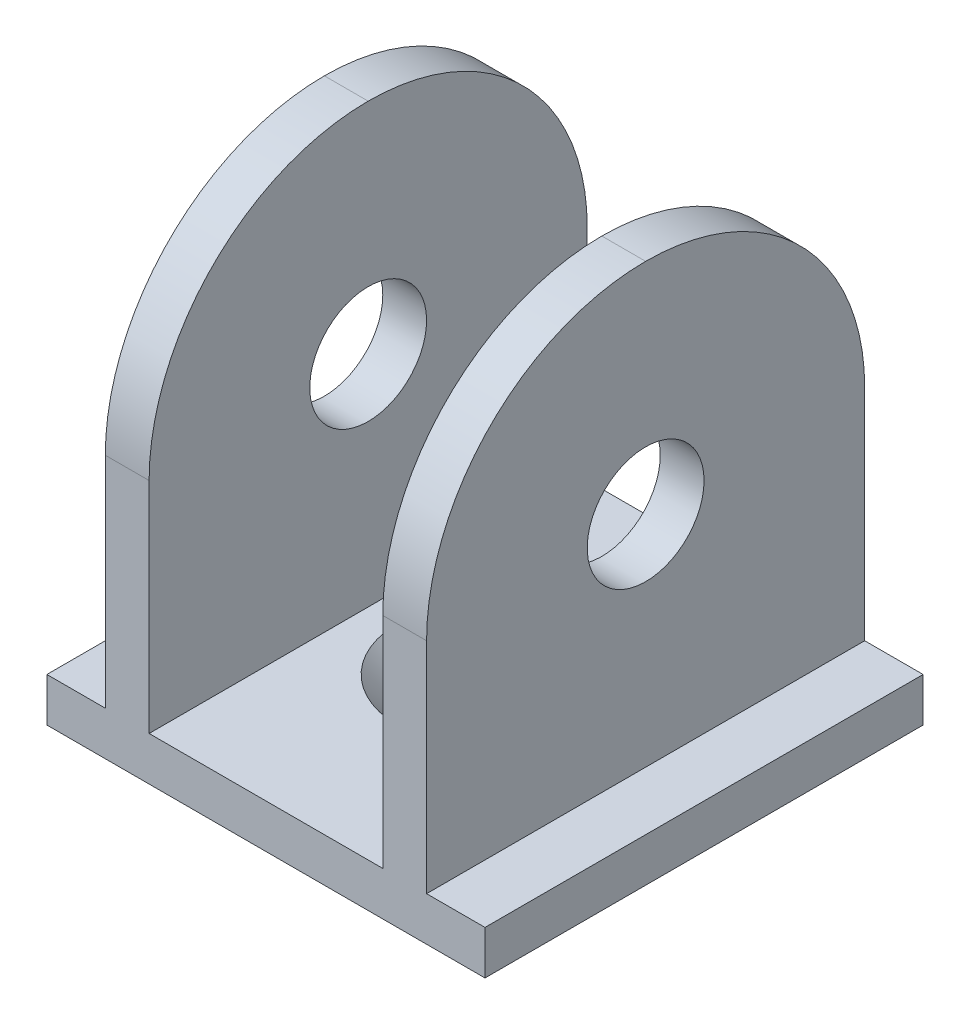
ISO-10303-21;
HEADER;
FILE_DESCRIPTION(('STEP AP214'),'2;1');
FILE_NAME('part.step','',(''),(''),'','','');
FILE_SCHEMA(('AUTOMOTIVE_DESIGN { 1 0 10303 214 1 1 1 1 }'));
ENDSEC;
DATA;
#1=APPLICATION_CONTEXT('core data for automotive mechanical design processes');
#2=APPLICATION_PROTOCOL_DEFINITION('international standard','automotive_design',2000,#1);
#3=PRODUCT_CONTEXT('',#1,'mechanical');
#4=PRODUCT('Part','Part','',(#3));
#5=PRODUCT_RELATED_PRODUCT_CATEGORY('part','',(#4));
#6=PRODUCT_DEFINITION_FORMATION('','',#4);
#7=PRODUCT_DEFINITION_CONTEXT('part definition',#1,'design');
#8=PRODUCT_DEFINITION('design','',#6,#7);
#9=PRODUCT_DEFINITION_SHAPE('','',#8);
#10=(LENGTH_UNIT() NAMED_UNIT(*) SI_UNIT(.MILLI.,.METRE.));
#11=(NAMED_UNIT(*) PLANE_ANGLE_UNIT() SI_UNIT($,.RADIAN.));
#12=(NAMED_UNIT(*) SI_UNIT($,.STERADIAN.) SOLID_ANGLE_UNIT());
#13=UNCERTAINTY_MEASURE_WITH_UNIT(LENGTH_MEASURE(1.E-05),#10,'distance_accuracy_value','');
#14=(GEOMETRIC_REPRESENTATION_CONTEXT(3) GLOBAL_UNCERTAINTY_ASSIGNED_CONTEXT((#13)) GLOBAL_UNIT_ASSIGNED_CONTEXT((#10,
#11,#12)) REPRESENTATION_CONTEXT('',''));
#15=CARTESIAN_POINT('',(0.,0.,0.));
#16=DIRECTION('',(0.,0.,1.));
#17=DIRECTION('',(1.,0.,0.));
#18=AXIS2_PLACEMENT_3D('',#15,#16,#17);
#19=CARTESIAN_POINT('',(0.,3.,0.));
#20=DIRECTION('',(0.,1.,0.));
#21=DIRECTION('',(0.,0.,1.));
#22=AXIS2_PLACEMENT_3D('',#19,#20,#21);
#23=PLANE('',#22);
#24=DIRECTION('',(-1.,0.,0.));
#25=VECTOR('',#24,1.);
#26=CARTESIAN_POINT('',(15.,3.,-15.));
#27=LINE('',#26,#25);
#28=CARTESIAN_POINT('',(15.,3.,-15.));
#29=VERTEX_POINT('',#28);
#30=CARTESIAN_POINT('',(11.,3.,-15.));
#31=VERTEX_POINT('',#30);
#32=EDGE_CURVE('E169',#29,#31,#27,.T.);
#33=ORIENTED_EDGE('',*,*,#32,.T.);
#34=DIRECTION('',(0.,0.,-1.));
#35=VECTOR('',#34,1.);
#36=CARTESIAN_POINT('',(11.,3.,-15.));
#37=LINE('',#36,#35);
#38=CARTESIAN_POINT('',(11.,3.,15.));
#39=VERTEX_POINT('',#38);
#40=EDGE_CURVE('E148',#39,#31,#37,.T.);
#41=ORIENTED_EDGE('',*,*,#40,.F.);
#42=DIRECTION('',(1.,0.,0.));
#43=VECTOR('',#42,1.);
#44=CARTESIAN_POINT('',(15.,3.,15.));
#45=LINE('',#44,#43);
#46=CARTESIAN_POINT('',(15.,3.,15.));
#47=VERTEX_POINT('',#46);
#48=EDGE_CURVE('E156',#39,#47,#45,.T.);
#49=ORIENTED_EDGE('',*,*,#48,.T.);
#50=DIRECTION('',(0.,0.,-1.));
#51=VECTOR('',#50,1.);
#52=CARTESIAN_POINT('',(15.,3.,15.));
#53=LINE('',#52,#51);
#54=EDGE_CURVE('E203',#47,#29,#53,.T.);
#55=ORIENTED_EDGE('',*,*,#54,.T.);
#56=EDGE_LOOP('',(#33,#41,#49,#55));
#57=FACE_BOUND('',#56,.T.);
#58=ADVANCED_FACE('F45',(#57),#23,.T.);
#59=CARTESIAN_POINT('',(0.,3.,0.));
#60=DIRECTION('',(0.,1.,0.));
#61=DIRECTION('',(0.,0.,1.));
#62=AXIS2_PLACEMENT_3D('',#59,#60,#61);
#63=CIRCLE('',#62,6.00000000000002);
#64=CARTESIAN_POINT('',(0.,3.,6.00000000000002));
#65=VERTEX_POINT('',#64);
#66=EDGE_CURVE('E11',#65,#65,#63,.F.);
#67=ORIENTED_EDGE('',*,*,#66,.T.);
#68=EDGE_LOOP('',(#67));
#69=FACE_BOUND('',#68,.T.);
#70=CARTESIAN_POINT('',(-8.,3.,15.));
#71=VERTEX_POINT('',#70);
#72=CARTESIAN_POINT('',(8.,3.,15.));
#73=VERTEX_POINT('',#72);
#74=EDGE_CURVE('E163',#71,#73,#45,.T.);
#75=ORIENTED_EDGE('',*,*,#74,.T.);
#76=DIRECTION('',(0.,0.,1.));
#77=VECTOR('',#76,1.);
#78=CARTESIAN_POINT('',(8.,3.,-15.));
#79=LINE('',#78,#77);
#80=CARTESIAN_POINT('',(8.,3.,-15.));
#81=VERTEX_POINT('',#80);
#82=EDGE_CURVE('E152',#81,#73,#79,.T.);
#83=ORIENTED_EDGE('',*,*,#82,.F.);
#84=CARTESIAN_POINT('',(-8.,3.,-15.));
#85=VERTEX_POINT('',#84);
#86=EDGE_CURVE('E210',#81,#85,#27,.T.);
#87=ORIENTED_EDGE('',*,*,#86,.T.);
#88=DIRECTION('',(0.,0.,-1.));
#89=VECTOR('',#88,1.);
#90=CARTESIAN_POINT('',(-8.,3.,-15.));
#91=LINE('',#90,#89);
#92=EDGE_CURVE('E176',#71,#85,#91,.T.);
#93=ORIENTED_EDGE('',*,*,#92,.F.);
#94=EDGE_LOOP('',(#75,#83,#87,#93));
#95=FACE_BOUND('',#94,.T.);
#96=ADVANCED_FACE('F317',(#69,#95),#23,.T.);
#97=DIRECTION('',(0.,0.,1.));
#98=VECTOR('',#97,1.);
#99=CARTESIAN_POINT('',(-11.,3.,-15.));
#100=LINE('',#99,#98);
#101=CARTESIAN_POINT('',(-11.,3.,-15.));
#102=VERTEX_POINT('',#101);
#103=CARTESIAN_POINT('',(-11.,3.,15.));
#104=VERTEX_POINT('',#103);
#105=EDGE_CURVE('E171',#102,#104,#100,.T.);
#106=ORIENTED_EDGE('',*,*,#105,.F.);
#107=CARTESIAN_POINT('',(-15.,3.,-15.));
#108=VERTEX_POINT('',#107);
#109=EDGE_CURVE('E206',#102,#108,#27,.T.);
#110=ORIENTED_EDGE('',*,*,#109,.T.);
#111=DIRECTION('',(0.,0.,1.));
#112=VECTOR('',#111,1.);
#113=CARTESIAN_POINT('',(-15.,3.,15.));
#114=LINE('',#113,#112);
#115=CARTESIAN_POINT('',(-15.,3.,15.));
#116=VERTEX_POINT('',#115);
#117=EDGE_CURVE('E164',#108,#116,#114,.T.);
#118=ORIENTED_EDGE('',*,*,#117,.T.);
#119=EDGE_CURVE('E166',#116,#104,#45,.T.);
#120=ORIENTED_EDGE('',*,*,#119,.T.);
#121=EDGE_LOOP('',(#106,#110,#118,#120));
#122=FACE_BOUND('',#121,.T.);
#123=ADVANCED_FACE('F346',(#122),#23,.T.);
#124=CARTESIAN_POINT('',(-15.,3.,15.));
#125=DIRECTION('',(1.,0.,0.));
#126=DIRECTION('',(0.,0.,-1.));
#127=AXIS2_PLACEMENT_3D('',#124,#125,#126);
#128=PLANE('',#127);
#129=DIRECTION('',(0.,0.,1.));
#130=VECTOR('',#129,1.);
#131=CARTESIAN_POINT('',(-15.,0.,15.));
#132=LINE('',#131,#130);
#133=CARTESIAN_POINT('',(-15.,0.,-15.));
#134=VERTEX_POINT('',#133);
#135=CARTESIAN_POINT('',(-15.,0.,15.));
#136=VERTEX_POINT('',#135);
#137=EDGE_CURVE('E196',#134,#136,#132,.T.);
#138=ORIENTED_EDGE('',*,*,#137,.T.);
#139=DIRECTION('',(0.,-1.,0.));
#140=VECTOR('',#139,1.);
#141=CARTESIAN_POINT('',(-15.,3.,15.));
#142=LINE('',#141,#140);
#143=EDGE_CURVE('E231',#116,#136,#142,.T.);
#144=ORIENTED_EDGE('',*,*,#143,.F.);
#145=ORIENTED_EDGE('',*,*,#117,.F.);
#146=DIRECTION('',(0.,-1.,0.));
#147=VECTOR('',#146,1.);
#148=CARTESIAN_POINT('',(-15.,3.,-15.));
#149=LINE('',#148,#147);
#150=EDGE_CURVE('E209',#108,#134,#149,.T.);
#151=ORIENTED_EDGE('',*,*,#150,.T.);
#152=EDGE_LOOP('',(#138,#144,#145,#151));
#153=FACE_BOUND('',#152,.T.);
#154=ADVANCED_FACE('F354',(#153),#128,.F.);
#155=CARTESIAN_POINT('',(15.,3.,15.));
#156=DIRECTION('',(0.,0.,-1.));
#157=DIRECTION('',(-1.,0.,0.));
#158=AXIS2_PLACEMENT_3D('',#155,#156,#157);
#159=PLANE('',#158);
#160=DIRECTION('',(0.,-1.,0.));
#161=VECTOR('',#160,1.);
#162=CARTESIAN_POINT('',(11.,33.,15.));
#163=LINE('',#162,#161);
#164=CARTESIAN_POINT('',(11.,18.,15.));
#165=VERTEX_POINT('',#164);
#166=EDGE_CURVE('E144',#165,#39,#163,.T.);
#167=ORIENTED_EDGE('',*,*,#166,.F.);
#168=DIRECTION('',(1.,0.,0.));
#169=VECTOR('',#168,1.);
#170=CARTESIAN_POINT('',(15.,18.,15.));
#171=LINE('',#170,#169);
#172=CARTESIAN_POINT('',(8.,18.,15.));
#173=VERTEX_POINT('',#172);
#174=EDGE_CURVE('E55',#165,#173,#171,.F.);
#175=ORIENTED_EDGE('',*,*,#174,.T.);
#176=DIRECTION('',(0.,-1.,0.));
#177=VECTOR('',#176,1.);
#178=CARTESIAN_POINT('',(8.,33.,15.));
#179=LINE('',#178,#177);
#180=EDGE_CURVE('E153',#173,#73,#179,.T.);
#181=ORIENTED_EDGE('',*,*,#180,.T.);
#182=ORIENTED_EDGE('',*,*,#74,.F.);
#183=DIRECTION('',(0.,-1.,0.));
#184=VECTOR('',#183,1.);
#185=CARTESIAN_POINT('',(-8.,33.,15.));
#186=LINE('',#185,#184);
#187=CARTESIAN_POINT('',(-8.,18.,15.));
#188=VERTEX_POINT('',#187);
#189=EDGE_CURVE('E190',#188,#71,#186,.T.);
#190=ORIENTED_EDGE('',*,*,#189,.F.);
#191=DIRECTION('',(1.,0.,0.));
#192=VECTOR('',#191,1.);
#193=CARTESIAN_POINT('',(-11.,18.,15.));
#194=LINE('',#193,#192);
#195=CARTESIAN_POINT('',(-11.,18.,15.));
#196=VERTEX_POINT('',#195);
#197=EDGE_CURVE('E265',#188,#196,#194,.F.);
#198=ORIENTED_EDGE('',*,*,#197,.T.);
#199=DIRECTION('',(0.,-1.,0.));
#200=VECTOR('',#199,1.);
#201=CARTESIAN_POINT('',(-11.,33.,15.));
#202=LINE('',#201,#200);
#203=EDGE_CURVE('E193',#196,#104,#202,.T.);
#204=ORIENTED_EDGE('',*,*,#203,.T.);
#205=ORIENTED_EDGE('',*,*,#119,.F.);
#206=ORIENTED_EDGE('',*,*,#143,.T.);
#207=DIRECTION('',(1.,0.,0.));
#208=VECTOR('',#207,1.);
#209=CARTESIAN_POINT('',(15.,0.,15.));
#210=LINE('',#209,#208);
#211=CARTESIAN_POINT('',(15.,0.,15.));
#212=VERTEX_POINT('',#211);
#213=EDGE_CURVE('E214',#136,#212,#210,.T.);
#214=ORIENTED_EDGE('',*,*,#213,.T.);
#215=DIRECTION('',(0.,-1.,0.));
#216=VECTOR('',#215,1.);
#217=CARTESIAN_POINT('',(15.,3.,15.));
#218=LINE('',#217,#216);
#219=EDGE_CURVE('E159',#47,#212,#218,.T.);
#220=ORIENTED_EDGE('',*,*,#219,.F.);
#221=ORIENTED_EDGE('',*,*,#48,.F.);
#222=EDGE_LOOP('',(#167,#175,#181,#182,#190,#198,#204,#205,#206,#214,#220,#221));
#223=FACE_BOUND('',#222,.T.);
#224=ADVANCED_FACE('F157',(#223),#159,.F.);
#225=CARTESIAN_POINT('',(15.,3.,15.));
#226=DIRECTION('',(-1.,0.,0.));
#227=DIRECTION('',(0.,0.,1.));
#228=AXIS2_PLACEMENT_3D('',#225,#226,#227);
#229=PLANE('',#228);
#230=DIRECTION('',(0.,0.,-1.));
#231=VECTOR('',#230,1.);
#232=CARTESIAN_POINT('',(15.,0.,15.));
#233=LINE('',#232,#231);
#234=CARTESIAN_POINT('',(15.,0.,-15.));
#235=VERTEX_POINT('',#234);
#236=EDGE_CURVE('E217',#212,#235,#233,.T.);
#237=ORIENTED_EDGE('',*,*,#236,.T.);
#238=DIRECTION('',(0.,-1.,0.));
#239=VECTOR('',#238,1.);
#240=CARTESIAN_POINT('',(15.,3.,-15.));
#241=LINE('',#240,#239);
#242=EDGE_CURVE('E225',#29,#235,#241,.T.);
#243=ORIENTED_EDGE('',*,*,#242,.F.);
#244=ORIENTED_EDGE('',*,*,#54,.F.);
#245=ORIENTED_EDGE('',*,*,#219,.T.);
#246=EDGE_LOOP('',(#237,#243,#244,#245));
#247=FACE_BOUND('',#246,.T.);
#248=ADVANCED_FACE('F387',(#247),#229,.F.);
#249=CARTESIAN_POINT('',(15.,3.,-15.));
#250=DIRECTION('',(0.,0.,1.));
#251=DIRECTION('',(1.,0.,0.));
#252=AXIS2_PLACEMENT_3D('',#249,#250,#251);
#253=PLANE('',#252);
#254=DIRECTION('',(0.,-1.,0.));
#255=VECTOR('',#254,1.);
#256=CARTESIAN_POINT('',(-11.,33.,-15.));
#257=LINE('',#256,#255);
#258=CARTESIAN_POINT('',(-11.,18.,-15.));
#259=VERTEX_POINT('',#258);
#260=EDGE_CURVE('E184',#259,#102,#257,.T.);
#261=ORIENTED_EDGE('',*,*,#260,.F.);
#262=DIRECTION('',(-1.,0.,0.));
#263=VECTOR('',#262,1.);
#264=CARTESIAN_POINT('',(-8.,18.,-15.));
#265=LINE('',#264,#263);
#266=CARTESIAN_POINT('',(-8.,18.,-15.));
#267=VERTEX_POINT('',#266);
#268=EDGE_CURVE('E245',#259,#267,#265,.F.);
#269=ORIENTED_EDGE('',*,*,#268,.T.);
#270=DIRECTION('',(0.,-1.,0.));
#271=VECTOR('',#270,1.);
#272=CARTESIAN_POINT('',(-8.,33.,-15.));
#273=LINE('',#272,#271);
#274=EDGE_CURVE('E187',#267,#85,#273,.T.);
#275=ORIENTED_EDGE('',*,*,#274,.T.);
#276=ORIENTED_EDGE('',*,*,#86,.F.);
#277=DIRECTION('',(0.,-1.,0.));
#278=VECTOR('',#277,1.);
#279=CARTESIAN_POINT('',(8.,33.,-15.));
#280=LINE('',#279,#278);
#281=CARTESIAN_POINT('',(8.,18.,-15.));
#282=VERTEX_POINT('',#281);
#283=EDGE_CURVE('E304',#282,#81,#280,.T.);
#284=ORIENTED_EDGE('',*,*,#283,.F.);
#285=DIRECTION('',(-1.,0.,0.));
#286=VECTOR('',#285,1.);
#287=CARTESIAN_POINT('',(15.,18.,-15.));
#288=LINE('',#287,#286);
#289=CARTESIAN_POINT('',(11.,18.,-15.));
#290=VERTEX_POINT('',#289);
#291=EDGE_CURVE('E241',#282,#290,#288,.F.);
#292=ORIENTED_EDGE('',*,*,#291,.T.);
#293=DIRECTION('',(0.,-1.,0.));
#294=VECTOR('',#293,1.);
#295=CARTESIAN_POINT('',(11.,33.,-15.));
#296=LINE('',#295,#294);
#297=EDGE_CURVE('E274',#290,#31,#296,.T.);
#298=ORIENTED_EDGE('',*,*,#297,.T.);
#299=ORIENTED_EDGE('',*,*,#32,.F.);
#300=ORIENTED_EDGE('',*,*,#242,.T.);
#301=DIRECTION('',(-1.,0.,0.));
#302=VECTOR('',#301,1.);
#303=CARTESIAN_POINT('',(15.,0.,-15.));
#304=LINE('',#303,#302);
#305=EDGE_CURVE('E199',#235,#134,#304,.T.);
#306=ORIENTED_EDGE('',*,*,#305,.T.);
#307=ORIENTED_EDGE('',*,*,#150,.F.);
#308=ORIENTED_EDGE('',*,*,#109,.F.);
#309=EDGE_LOOP('',(#261,#269,#275,#276,#284,#292,#298,#299,#300,#306,#307,#308));
#310=FACE_BOUND('',#309,.T.);
#311=ADVANCED_FACE('F327',(#310),#253,.F.);
#312=CARTESIAN_POINT('',(0.,0.,0.));
#313=DIRECTION('',(0.,1.,0.));
#314=DIRECTION('',(0.,0.,1.));
#315=AXIS2_PLACEMENT_3D('',#312,#313,#314);
#316=PLANE('',#315);
#317=CARTESIAN_POINT('',(0.,0.,0.));
#318=DIRECTION('',(0.,1.,0.));
#319=DIRECTION('',(0.,0.,1.));
#320=AXIS2_PLACEMENT_3D('',#317,#318,#319);
#321=CIRCLE('',#320,3.);
#322=CARTESIAN_POINT('',(0.,0.,3.));
#323=VERTEX_POINT('',#322);
#324=EDGE_CURVE('E291',#323,#323,#321,.T.);
#325=ORIENTED_EDGE('',*,*,#324,.T.);
#326=EDGE_LOOP('',(#325));
#327=FACE_BOUND('',#326,.T.);
#328=ORIENTED_EDGE('',*,*,#137,.F.);
#329=ORIENTED_EDGE('',*,*,#305,.F.);
#330=ORIENTED_EDGE('',*,*,#236,.F.);
#331=ORIENTED_EDGE('',*,*,#213,.F.);
#332=EDGE_LOOP('',(#328,#329,#330,#331));
#333=FACE_BOUND('',#332,.T.);
#334=ADVANCED_FACE('F384',(#327,#333),#316,.F.);
#335=CARTESIAN_POINT('',(-11.,33.,-15.));
#336=DIRECTION('',(1.,0.,0.));
#337=DIRECTION('',(0.,0.,-1.));
#338=AXIS2_PLACEMENT_3D('',#335,#336,#337);
#339=PLANE('',#338);
#340=CARTESIAN_POINT('',(-11.,18.,0.));
#341=DIRECTION('',(1.,0.,0.));
#342=DIRECTION('',(0.,0.,-1.));
#343=AXIS2_PLACEMENT_3D('',#340,#341,#342);
#344=CIRCLE('',#343,4.);
#345=CARTESIAN_POINT('',(-11.,18.,-4.));
#346=VERTEX_POINT('',#345);
#347=EDGE_CURVE('E278',#346,#346,#344,.T.);
#348=ORIENTED_EDGE('',*,*,#347,.T.);
#349=EDGE_LOOP('',(#348));
#350=FACE_BOUND('',#349,.T.);
#351=CARTESIAN_POINT('',(-11.,18.,0.));
#352=DIRECTION('',(1.,0.,0.));
#353=DIRECTION('',(0.,0.,-1.));
#354=AXIS2_PLACEMENT_3D('',#351,#352,#353);
#355=CIRCLE('',#354,15.);
#356=CARTESIAN_POINT('',(-11.,33.,0.));
#357=VERTEX_POINT('',#356);
#358=EDGE_CURVE('E235',#196,#357,#355,.F.);
#359=ORIENTED_EDGE('',*,*,#358,.T.);
#360=CARTESIAN_POINT('',(-11.,18.,0.));
#361=DIRECTION('',(1.,0.,0.));
#362=DIRECTION('',(0.,0.,-1.));
#363=AXIS2_PLACEMENT_3D('',#360,#361,#362);
#364=CIRCLE('',#363,15.);
#365=EDGE_CURVE('E238',#357,#259,#364,.F.);
#366=ORIENTED_EDGE('',*,*,#365,.T.);
#367=ORIENTED_EDGE('',*,*,#260,.T.);
#368=ORIENTED_EDGE('',*,*,#105,.T.);
#369=ORIENTED_EDGE('',*,*,#203,.F.);
#370=EDGE_LOOP('',(#359,#366,#367,#368,#369));
#371=FACE_BOUND('',#370,.T.);
#372=ADVANCED_FACE('F379',(#350,#371),#339,.F.);
#373=CARTESIAN_POINT('',(-8.,33.,-15.));
#374=DIRECTION('',(-1.,0.,0.));
#375=DIRECTION('',(0.,0.,1.));
#376=AXIS2_PLACEMENT_3D('',#373,#374,#375);
#377=PLANE('',#376);
#378=CARTESIAN_POINT('',(-8.,18.,0.));
#379=DIRECTION('',(-1.,0.,0.));
#380=DIRECTION('',(0.,0.,1.));
#381=AXIS2_PLACEMENT_3D('',#378,#379,#380);
#382=CIRCLE('',#381,4.);
#383=CARTESIAN_POINT('',(-8.,18.,-4.));
#384=VERTEX_POINT('',#383);
#385=EDGE_CURVE('E282',#384,#384,#382,.T.);
#386=ORIENTED_EDGE('',*,*,#385,.T.);
#387=EDGE_LOOP('',(#386));
#388=FACE_BOUND('',#387,.T.);
#389=ORIENTED_EDGE('',*,*,#274,.F.);
#390=CARTESIAN_POINT('',(-8.,18.,0.));
#391=DIRECTION('',(-1.,0.,0.));
#392=DIRECTION('',(0.,0.,1.));
#393=AXIS2_PLACEMENT_3D('',#390,#391,#392);
#394=CIRCLE('',#393,15.);
#395=CARTESIAN_POINT('',(-8.,33.,0.));
#396=VERTEX_POINT('',#395);
#397=EDGE_CURVE('E252',#267,#396,#394,.F.);
#398=ORIENTED_EDGE('',*,*,#397,.T.);
#399=CARTESIAN_POINT('',(-8.,18.,0.));
#400=DIRECTION('',(-1.,0.,0.));
#401=DIRECTION('',(0.,0.,1.));
#402=AXIS2_PLACEMENT_3D('',#399,#400,#401);
#403=CIRCLE('',#402,15.);
#404=EDGE_CURVE('E249',#396,#188,#403,.F.);
#405=ORIENTED_EDGE('',*,*,#404,.T.);
#406=ORIENTED_EDGE('',*,*,#189,.T.);
#407=ORIENTED_EDGE('',*,*,#92,.T.);
#408=EDGE_LOOP('',(#389,#398,#405,#406,#407));
#409=FACE_BOUND('',#408,.T.);
#410=ADVANCED_FACE('F372',(#388,#409),#377,.F.);
#411=CARTESIAN_POINT('',(11.,33.,-15.));
#412=DIRECTION('',(-1.,0.,0.));
#413=DIRECTION('',(0.,0.,1.));
#414=AXIS2_PLACEMENT_3D('',#411,#412,#413);
#415=PLANE('',#414);
#416=CARTESIAN_POINT('',(11.,18.,0.));
#417=DIRECTION('',(1.,0.,0.));
#418=DIRECTION('',(0.,0.,-1.));
#419=AXIS2_PLACEMENT_3D('',#416,#417,#418);
#420=CIRCLE('',#419,4.);
#421=CARTESIAN_POINT('',(11.,18.,-4.));
#422=VERTEX_POINT('',#421);
#423=EDGE_CURVE('E283',#422,#422,#420,.T.);
#424=ORIENTED_EDGE('',*,*,#423,.F.);
#425=EDGE_LOOP('',(#424));
#426=FACE_BOUND('',#425,.T.);
#427=ORIENTED_EDGE('',*,*,#297,.F.);
#428=CARTESIAN_POINT('',(11.,18.,0.));
#429=DIRECTION('',(-1.,0.,0.));
#430=DIRECTION('',(0.,0.,1.));
#431=AXIS2_PLACEMENT_3D('',#428,#429,#430);
#432=CIRCLE('',#431,15.);
#433=CARTESIAN_POINT('',(11.,33.,0.));
#434=VERTEX_POINT('',#433);
#435=EDGE_CURVE('E67',#290,#434,#432,.F.);
#436=ORIENTED_EDGE('',*,*,#435,.T.);
#437=CARTESIAN_POINT('',(11.,18.,0.));
#438=DIRECTION('',(-1.,0.,0.));
#439=DIRECTION('',(0.,0.,1.));
#440=AXIS2_PLACEMENT_3D('',#437,#438,#439);
#441=CIRCLE('',#440,15.);
#442=EDGE_CURVE('E62',#434,#165,#441,.F.);
#443=ORIENTED_EDGE('',*,*,#442,.T.);
#444=ORIENTED_EDGE('',*,*,#166,.T.);
#445=ORIENTED_EDGE('',*,*,#40,.T.);
#446=EDGE_LOOP('',(#427,#436,#443,#444,#445));
#447=FACE_BOUND('',#446,.T.);
#448=ADVANCED_FACE('F146',(#426,#447),#415,.F.);
#449=CARTESIAN_POINT('',(8.,33.,-15.));
#450=DIRECTION('',(1.,0.,0.));
#451=DIRECTION('',(0.,0.,-1.));
#452=AXIS2_PLACEMENT_3D('',#449,#450,#451);
#453=PLANE('',#452);
#454=CARTESIAN_POINT('',(7.99999999999999,18.,0.));
#455=DIRECTION('',(1.,0.,0.));
#456=DIRECTION('',(0.,0.,-1.));
#457=AXIS2_PLACEMENT_3D('',#454,#455,#456);
#458=CIRCLE('',#457,4.);
#459=CARTESIAN_POINT('',(7.99999999999999,18.,-4.));
#460=VERTEX_POINT('',#459);
#461=EDGE_CURVE('E279',#460,#460,#458,.T.);
#462=ORIENTED_EDGE('',*,*,#461,.T.);
#463=EDGE_LOOP('',(#462));
#464=FACE_BOUND('',#463,.T.);
#465=CARTESIAN_POINT('',(8.,18.,0.));
#466=DIRECTION('',(1.,0.,0.));
#467=DIRECTION('',(0.,0.,-1.));
#468=AXIS2_PLACEMENT_3D('',#465,#466,#467);
#469=CIRCLE('',#468,15.);
#470=CARTESIAN_POINT('',(8.,33.,0.));
#471=VERTEX_POINT('',#470);
#472=EDGE_CURVE('E255',#173,#471,#469,.F.);
#473=ORIENTED_EDGE('',*,*,#472,.T.);
#474=CARTESIAN_POINT('',(8.,18.,0.));
#475=DIRECTION('',(1.,0.,0.));
#476=DIRECTION('',(0.,0.,-1.));
#477=AXIS2_PLACEMENT_3D('',#474,#475,#476);
#478=CIRCLE('',#477,15.);
#479=EDGE_CURVE('E258',#471,#282,#478,.F.);
#480=ORIENTED_EDGE('',*,*,#479,.T.);
#481=ORIENTED_EDGE('',*,*,#283,.T.);
#482=ORIENTED_EDGE('',*,*,#82,.T.);
#483=ORIENTED_EDGE('',*,*,#180,.F.);
#484=EDGE_LOOP('',(#473,#480,#481,#482,#483));
#485=FACE_BOUND('',#484,.T.);
#486=ADVANCED_FACE('F321',(#464,#485),#453,.F.);
#487=CARTESIAN_POINT('',(0.,18.,0.));
#488=DIRECTION('',(-1.,0.,0.));
#489=DIRECTION('',(0.,0.,1.));
#490=AXIS2_PLACEMENT_3D('',#487,#488,#489);
#491=CYLINDRICAL_SURFACE('',#490,15.);
#492=ORIENTED_EDGE('',*,*,#197,.F.);
#493=ORIENTED_EDGE('',*,*,#404,.F.);
#494=DIRECTION('',(1.,0.,0.));
#495=VECTOR('',#494,1.);
#496=CARTESIAN_POINT('',(-8.,33.,0.));
#497=LINE('',#496,#495);
#498=EDGE_CURVE('E270',#357,#396,#497,.T.);
#499=ORIENTED_EDGE('',*,*,#498,.F.);
#500=ORIENTED_EDGE('',*,*,#358,.F.);
#501=EDGE_LOOP('',(#492,#493,#499,#500));
#502=FACE_BOUND('',#501,.T.);
#503=ADVANCED_FACE('F341',(#502),#491,.T.);
#504=CARTESIAN_POINT('',(0.,18.,0.));
#505=DIRECTION('',(1.,0.,0.));
#506=DIRECTION('',(0.,0.,-1.));
#507=AXIS2_PLACEMENT_3D('',#504,#505,#506);
#508=CYLINDRICAL_SURFACE('',#507,15.);
#509=ORIENTED_EDGE('',*,*,#397,.F.);
#510=ORIENTED_EDGE('',*,*,#268,.F.);
#511=ORIENTED_EDGE('',*,*,#365,.F.);
#512=ORIENTED_EDGE('',*,*,#498,.T.);
#513=EDGE_LOOP('',(#509,#510,#511,#512));
#514=FACE_BOUND('',#513,.T.);
#515=ADVANCED_FACE('F334',(#514),#508,.T.);
#516=CARTESIAN_POINT('',(0.,18.,0.));
#517=DIRECTION('',(1.,0.,0.));
#518=DIRECTION('',(0.,0.,-1.));
#519=AXIS2_PLACEMENT_3D('',#516,#517,#518);
#520=CYLINDRICAL_SURFACE('',#519,15.);
#521=ORIENTED_EDGE('',*,*,#174,.F.);
#522=ORIENTED_EDGE('',*,*,#442,.F.);
#523=DIRECTION('',(1.,0.,0.));
#524=VECTOR('',#523,1.);
#525=CARTESIAN_POINT('',(0.,33.,0.));
#526=LINE('',#525,#524);
#527=EDGE_CURVE('E275',#471,#434,#526,.T.);
#528=ORIENTED_EDGE('',*,*,#527,.F.);
#529=ORIENTED_EDGE('',*,*,#472,.F.);
#530=EDGE_LOOP('',(#521,#522,#528,#529));
#531=FACE_BOUND('',#530,.T.);
#532=ADVANCED_FACE('F332',(#531),#520,.T.);
#533=CARTESIAN_POINT('',(0.,18.,0.));
#534=DIRECTION('',(-1.,0.,0.));
#535=DIRECTION('',(0.,0.,1.));
#536=AXIS2_PLACEMENT_3D('',#533,#534,#535);
#537=CYLINDRICAL_SURFACE('',#536,15.);
#538=ORIENTED_EDGE('',*,*,#435,.F.);
#539=ORIENTED_EDGE('',*,*,#291,.F.);
#540=ORIENTED_EDGE('',*,*,#479,.F.);
#541=ORIENTED_EDGE('',*,*,#527,.T.);
#542=EDGE_LOOP('',(#538,#539,#540,#541));
#543=FACE_BOUND('',#542,.T.);
#544=ADVANCED_FACE('F329',(#543),#537,.T.);
#545=CARTESIAN_POINT('',(-15.,18.,0.));
#546=DIRECTION('',(1.,0.,0.));
#547=DIRECTION('',(0.,0.,-1.));
#548=AXIS2_PLACEMENT_3D('',#545,#546,#547);
#549=CYLINDRICAL_SURFACE('',#548,4.);
#550=CARTESIAN_POINT('',(11.,18.,-4.));
#551=CARTESIAN_POINT('',(10.96875,18.,-4.));
#552=CARTESIAN_POINT('',(10.9375,18.,-4.));
#553=CARTESIAN_POINT('',(10.875,18.,-4.));
#554=CARTESIAN_POINT('',(10.84375,18.,-4.));
#555=CARTESIAN_POINT('',(10.78125,18.,-4.));
#556=CARTESIAN_POINT('',(10.75,18.,-4.));
#557=CARTESIAN_POINT('',(10.6875,18.,-4.));
#558=CARTESIAN_POINT('',(10.65625,18.,-4.));
#559=CARTESIAN_POINT('',(10.59375,18.,-4.));
#560=CARTESIAN_POINT('',(10.5625,18.,-4.));
#561=CARTESIAN_POINT('',(10.5,18.,-4.));
#562=CARTESIAN_POINT('',(10.46875,18.,-4.));
#563=CARTESIAN_POINT('',(10.40625,18.,-4.));
#564=CARTESIAN_POINT('',(10.375,18.,-4.));
#565=CARTESIAN_POINT('',(10.3125,18.,-4.));
#566=CARTESIAN_POINT('',(10.28125,18.,-4.));
#567=CARTESIAN_POINT('',(10.21875,18.,-4.));
#568=CARTESIAN_POINT('',(10.1875,18.,-4.));
#569=CARTESIAN_POINT('',(10.125,18.,-4.));
#570=CARTESIAN_POINT('',(10.09375,18.,-4.));
#571=CARTESIAN_POINT('',(10.03125,18.,-4.));
#572=CARTESIAN_POINT('',(10.,18.,-4.));
#573=CARTESIAN_POINT('',(9.9375,18.,-4.));
#574=CARTESIAN_POINT('',(9.90625,18.,-4.));
#575=CARTESIAN_POINT('',(9.84375,18.,-4.));
#576=CARTESIAN_POINT('',(9.8125,18.,-4.));
#577=CARTESIAN_POINT('',(9.75,18.,-4.));
#578=CARTESIAN_POINT('',(9.71875,18.,-4.));
#579=CARTESIAN_POINT('',(9.65625,18.,-4.));
#580=CARTESIAN_POINT('',(9.625,18.,-4.));
#581=CARTESIAN_POINT('',(9.5625,18.,-4.));
#582=CARTESIAN_POINT('',(9.53125,18.,-4.));
#583=CARTESIAN_POINT('',(9.46875,18.,-4.));
#584=CARTESIAN_POINT('',(9.4375,18.,-4.));
#585=CARTESIAN_POINT('',(9.375,18.,-4.));
#586=CARTESIAN_POINT('',(9.34375,18.,-4.));
#587=CARTESIAN_POINT('',(9.28125,18.,-4.));
#588=CARTESIAN_POINT('',(9.25,18.,-4.));
#589=CARTESIAN_POINT('',(9.1875,18.,-4.));
#590=CARTESIAN_POINT('',(9.15625,18.,-4.));
#591=CARTESIAN_POINT('',(9.09375,18.,-4.));
#592=CARTESIAN_POINT('',(9.0625,18.,-4.));
#593=CARTESIAN_POINT('',(9.,18.,-4.));
#594=CARTESIAN_POINT('',(8.96875,18.,-4.));
#595=CARTESIAN_POINT('',(8.90625,18.,-4.));
#596=CARTESIAN_POINT('',(8.875,18.,-4.));
#597=CARTESIAN_POINT('',(8.8125,18.,-4.));
#598=CARTESIAN_POINT('',(8.78125,18.,-4.));
#599=CARTESIAN_POINT('',(8.71875,18.,-4.));
#600=CARTESIAN_POINT('',(8.6875,18.,-4.));
#601=CARTESIAN_POINT('',(8.62499999999999,18.,-4.));
#602=CARTESIAN_POINT('',(8.59374999999999,18.,-4.));
#603=CARTESIAN_POINT('',(8.53124999999999,18.,-4.));
#604=CARTESIAN_POINT('',(8.49999999999999,18.,-4.));
#605=CARTESIAN_POINT('',(8.43749999999999,18.,-4.));
#606=CARTESIAN_POINT('',(8.40624999999999,18.,-4.));
#607=CARTESIAN_POINT('',(8.34374999999999,18.,-4.));
#608=CARTESIAN_POINT('',(8.31249999999999,18.,-4.));
#609=CARTESIAN_POINT('',(8.24999999999999,18.,-4.));
#610=CARTESIAN_POINT('',(8.21874999999999,18.,-4.));
#611=CARTESIAN_POINT('',(8.15624999999999,18.,-4.));
#612=CARTESIAN_POINT('',(8.12499999999999,18.,-4.));
#613=CARTESIAN_POINT('',(8.06249999999999,18.,-4.));
#614=CARTESIAN_POINT('',(8.03124999999999,18.,-4.));
#615=CARTESIAN_POINT('',(7.99999999999999,18.,-4.));
#616=B_SPLINE_CURVE_WITH_KNOTS('',3,(#550,#551,#552,#553,#554,#555,#556,#557,#558,#559,#560,
#561,#562,#563,#564,#565,#566,#567,#568,#569,#570,#571,#572,#573,#574,#575,#576,#577,#578,#579,
#580,#581,#582,#583,#584,#585,#586,#587,#588,#589,#590,#591,#592,#593,#594,#595,#596,#597,#598,
#599,#600,#601,#602,#603,#604,#605,#606,#607,#608,#609,#610,#611,#612,#613,#614,#615),
.UNSPECIFIED.,.F.,.F.,(4,2,2,2,2,2,2,2,2,2,2,2,2,2,2,2,2,2,2,2,2,2,2,2,2,2,2,2,2,2,2,2,4),(0.,
0.0937500000000001,0.1875,0.28125,0.375,0.46875,0.5625,0.656250000000001,0.750000000000001,
0.843750000000001,0.937500000000001,1.03125,1.125,1.21875,1.3125,1.40625,1.5,1.59375,1.6875,
1.78125,1.875,1.96875,2.0625,2.15625,2.25,2.34375,2.4375,2.53125,2.625,2.71875,2.8125,2.90625,
3.),.UNSPECIFIED.);
#617=EDGE_CURVE('BSEAM339',#422,#460,#616,.T.);
#618=ORIENTED_EDGE('',*,*,#423,.T.);
#619=ORIENTED_EDGE('',*,*,#461,.F.);
#620=ORIENTED_EDGE('',*,*,#617,.T.);
#621=ORIENTED_EDGE('',*,*,#617,.F.);
#622=EDGE_LOOP('',(#618,#620,#619,#621));
#623=FACE_BOUND('',#622,.T.);
#624=ADVANCED_FACE('F339',(#623),#549,.F.);
#625=CARTESIAN_POINT('',(-8.,18.,-4.));
#626=CARTESIAN_POINT('',(-8.03125,18.,-4.));
#627=CARTESIAN_POINT('',(-8.0625,18.,-4.));
#628=CARTESIAN_POINT('',(-8.125,18.,-4.));
#629=CARTESIAN_POINT('',(-8.15625,18.,-4.));
#630=CARTESIAN_POINT('',(-8.21875,18.,-4.));
#631=CARTESIAN_POINT('',(-8.25,18.,-4.));
#632=CARTESIAN_POINT('',(-8.3125,18.,-4.));
#633=CARTESIAN_POINT('',(-8.34375,18.,-4.));
#634=CARTESIAN_POINT('',(-8.40625,18.,-4.));
#635=CARTESIAN_POINT('',(-8.4375,18.,-4.));
#636=CARTESIAN_POINT('',(-8.5,18.,-4.));
#637=CARTESIAN_POINT('',(-8.53125,18.,-4.));
#638=CARTESIAN_POINT('',(-8.59375,18.,-4.));
#639=CARTESIAN_POINT('',(-8.625,18.,-4.));
#640=CARTESIAN_POINT('',(-8.6875,18.,-4.));
#641=CARTESIAN_POINT('',(-8.71875,18.,-4.));
#642=CARTESIAN_POINT('',(-8.78125,18.,-4.));
#643=CARTESIAN_POINT('',(-8.8125,18.,-4.));
#644=CARTESIAN_POINT('',(-8.875,18.,-4.));
#645=CARTESIAN_POINT('',(-8.90625,18.,-4.));
#646=CARTESIAN_POINT('',(-8.96875,18.,-4.));
#647=CARTESIAN_POINT('',(-9.,18.,-4.));
#648=CARTESIAN_POINT('',(-9.0625,18.,-4.));
#649=CARTESIAN_POINT('',(-9.09375,18.,-4.));
#650=CARTESIAN_POINT('',(-9.15625,18.,-4.));
#651=CARTESIAN_POINT('',(-9.1875,18.,-4.));
#652=CARTESIAN_POINT('',(-9.25,18.,-4.));
#653=CARTESIAN_POINT('',(-9.28125,18.,-4.));
#654=CARTESIAN_POINT('',(-9.34375,18.,-4.));
#655=CARTESIAN_POINT('',(-9.375,18.,-4.));
#656=CARTESIAN_POINT('',(-9.4375,18.,-4.));
#657=CARTESIAN_POINT('',(-9.46875,18.,-4.));
#658=CARTESIAN_POINT('',(-9.53125,18.,-4.));
#659=CARTESIAN_POINT('',(-9.5625,18.,-4.));
#660=CARTESIAN_POINT('',(-9.625,18.,-4.));
#661=CARTESIAN_POINT('',(-9.65625,18.,-4.));
#662=CARTESIAN_POINT('',(-9.71875,18.,-4.));
#663=CARTESIAN_POINT('',(-9.75,18.,-4.));
#664=CARTESIAN_POINT('',(-9.8125,18.,-4.));
#665=CARTESIAN_POINT('',(-9.84375,18.,-4.));
#666=CARTESIAN_POINT('',(-9.90625,18.,-4.));
#667=CARTESIAN_POINT('',(-9.9375,18.,-4.));
#668=CARTESIAN_POINT('',(-10.,18.,-4.));
#669=CARTESIAN_POINT('',(-10.03125,18.,-4.));
#670=CARTESIAN_POINT('',(-10.09375,18.,-4.));
#671=CARTESIAN_POINT('',(-10.125,18.,-4.));
#672=CARTESIAN_POINT('',(-10.1875,18.,-4.));
#673=CARTESIAN_POINT('',(-10.21875,18.,-4.));
#674=CARTESIAN_POINT('',(-10.28125,18.,-4.));
#675=CARTESIAN_POINT('',(-10.3125,18.,-4.));
#676=CARTESIAN_POINT('',(-10.375,18.,-4.));
#677=CARTESIAN_POINT('',(-10.40625,18.,-4.));
#678=CARTESIAN_POINT('',(-10.46875,18.,-4.));
#679=CARTESIAN_POINT('',(-10.5,18.,-4.));
#680=CARTESIAN_POINT('',(-10.5625,18.,-4.));
#681=CARTESIAN_POINT('',(-10.59375,18.,-4.));
#682=CARTESIAN_POINT('',(-10.65625,18.,-4.));
#683=CARTESIAN_POINT('',(-10.6875,18.,-4.));
#684=CARTESIAN_POINT('',(-10.75,18.,-4.));
#685=CARTESIAN_POINT('',(-10.78125,18.,-4.));
#686=CARTESIAN_POINT('',(-10.84375,18.,-4.));
#687=CARTESIAN_POINT('',(-10.875,18.,-4.));
#688=CARTESIAN_POINT('',(-10.9375,18.,-4.));
#689=CARTESIAN_POINT('',(-10.96875,18.,-4.));
#690=CARTESIAN_POINT('',(-11.,18.,-4.));
#691=B_SPLINE_CURVE_WITH_KNOTS('',3,(#625,#626,#627,#628,#629,#630,#631,#632,#633,#634,#635,
#636,#637,#638,#639,#640,#641,#642,#643,#644,#645,#646,#647,#648,#649,#650,#651,#652,#653,#654,
#655,#656,#657,#658,#659,#660,#661,#662,#663,#664,#665,#666,#667,#668,#669,#670,#671,#672,#673,
#674,#675,#676,#677,#678,#679,#680,#681,#682,#683,#684,#685,#686,#687,#688,#689,#690),
.UNSPECIFIED.,.F.,.F.,(4,2,2,2,2,2,2,2,2,2,2,2,2,2,2,2,2,2,2,2,2,2,2,2,2,2,2,2,2,2,2,2,4),(0.,
0.0937500000000001,0.1875,0.28125,0.375,0.46875,0.5625,0.656250000000001,0.750000000000001,
0.843750000000001,0.937499999999999,1.03125,1.125,1.21875,1.3125,1.40625,1.5,1.59375,1.6875,
1.78125,1.875,1.96875,2.0625,2.15625,2.25,2.34375,2.4375,2.53125,2.625,2.71875,2.8125,2.90625,
3.),.UNSPECIFIED.);
#692=EDGE_CURVE('BSEAM420',#384,#346,#691,.T.);
#693=ORIENTED_EDGE('',*,*,#385,.F.);
#694=ORIENTED_EDGE('',*,*,#347,.F.);
#695=ORIENTED_EDGE('',*,*,#692,.T.);
#696=ORIENTED_EDGE('',*,*,#692,.F.);
#697=EDGE_LOOP('',(#693,#695,#694,#696));
#698=FACE_BOUND('',#697,.T.);
#699=ADVANCED_FACE('F420',(#698),#549,.F.);
#700=CARTESIAN_POINT('',(0.,0.,0.));
#701=DIRECTION('',(0.,1.,0.));
#702=DIRECTION('',(0.,0.,1.));
#703=AXIS2_PLACEMENT_3D('',#700,#701,#702);
#704=CONICAL_SURFACE('',#703,3.,0.78539816339745);
#705=ORIENTED_EDGE('',*,*,#66,.F.);
#706=EDGE_LOOP('',(#705));
#707=FACE_BOUND('',#706,.T.);
#708=ORIENTED_EDGE('',*,*,#324,.F.);
#709=EDGE_LOOP('',(#708));
#710=FACE_BOUND('',#709,.T.);
#711=ADVANCED_FACE('F48',(#707,#710),#704,.F.);
#712=CLOSED_SHELL('',(#58,#96,#123,#154,#224,#248,#311,#334,#372,#410,#448,#486,#503,#515,#532,
#544,#624,#699,#711));
#713=MANIFOLD_SOLID_BREP('B2',#712);
#714=ADVANCED_BREP_SHAPE_REPRESENTATION('',(#18,#713),#14);
#715=SHAPE_DEFINITION_REPRESENTATION(#9,#714);
ENDSEC;
END-ISO-10303-21;
